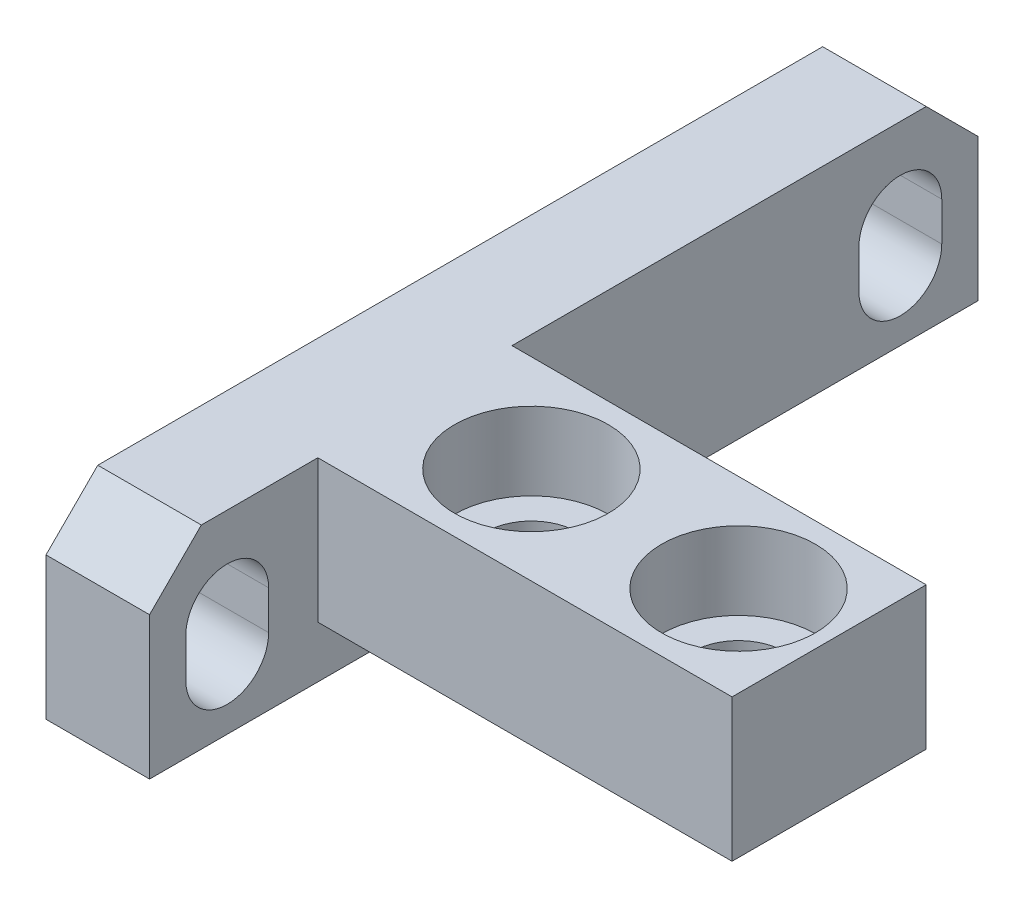
ISO-10303-21;
HEADER;
FILE_DESCRIPTION(('STEP AP214'),'2;1');
FILE_NAME('part.step','',(''),(''),'','','');
FILE_SCHEMA(('AUTOMOTIVE_DESIGN { 1 0 10303 214 1 1 1 1 }'));
ENDSEC;
DATA;
#1=APPLICATION_CONTEXT('core data for automotive mechanical design processes');
#2=APPLICATION_PROTOCOL_DEFINITION('international standard','automotive_design',2000,#1);
#3=PRODUCT_CONTEXT('',#1,'mechanical');
#4=PRODUCT('Part','Part','',(#3));
#5=PRODUCT_RELATED_PRODUCT_CATEGORY('part','',(#4));
#6=PRODUCT_DEFINITION_FORMATION('','',#4);
#7=PRODUCT_DEFINITION_CONTEXT('part definition',#1,'design');
#8=PRODUCT_DEFINITION('design','',#6,#7);
#9=PRODUCT_DEFINITION_SHAPE('','',#8);
#10=(LENGTH_UNIT() NAMED_UNIT(*) SI_UNIT(.MILLI.,.METRE.));
#11=(NAMED_UNIT(*) PLANE_ANGLE_UNIT() SI_UNIT($,.RADIAN.));
#12=(NAMED_UNIT(*) SI_UNIT($,.STERADIAN.) SOLID_ANGLE_UNIT());
#13=UNCERTAINTY_MEASURE_WITH_UNIT(LENGTH_MEASURE(1.E-05),#10,'distance_accuracy_value','');
#14=(GEOMETRIC_REPRESENTATION_CONTEXT(3) GLOBAL_UNCERTAINTY_ASSIGNED_CONTEXT((#13)) GLOBAL_UNIT_ASSIGNED_CONTEXT((#10,
#11,#12)) REPRESENTATION_CONTEXT('',''));
#15=CARTESIAN_POINT('',(0.,0.,0.));
#16=DIRECTION('',(0.,0.,1.));
#17=DIRECTION('',(1.,0.,0.));
#18=AXIS2_PLACEMENT_3D('',#15,#16,#17);
#19=CARTESIAN_POINT('',(-6.2069806856867,11.6480769609291,30.6));
#20=DIRECTION('',(0.,0.,1.));
#21=DIRECTION('',(1.,0.,0.));
#22=AXIS2_PLACEMENT_3D('',#19,#20,#21);
#23=PLANE('',#22);
#24=DIRECTION('',(-1.,0.,0.));
#25=VECTOR('',#24,1.);
#26=CARTESIAN_POINT('',(-6.2069806856867,11.6480769609291,30.6));
#27=LINE('',#26,#25);
#28=CARTESIAN_POINT('',(-10.2069806856867,11.6480769609291,30.6));
#29=VERTEX_POINT('',#28);
#30=CARTESIAN_POINT('',(-6.2069806856867,11.6480769609291,30.6));
#31=VERTEX_POINT('',#30);
#32=EDGE_CURVE('E239',#29,#31,#27,.F.);
#33=ORIENTED_EDGE('',*,*,#32,.T.);
#34=DIRECTION('',(0.,1.,0.));
#35=VECTOR('',#34,1.);
#36=CARTESIAN_POINT('',(-6.2069806856867,11.6480769609291,30.6));
#37=LINE('',#36,#35);
#38=CARTESIAN_POINT('',(-6.2069806856867,10.1480769609291,30.6));
#39=VERTEX_POINT('',#38);
#40=EDGE_CURVE('E263',#39,#31,#37,.T.);
#41=ORIENTED_EDGE('',*,*,#40,.F.);
#42=DIRECTION('',(-1.,0.,0.));
#43=VECTOR('',#42,1.);
#44=CARTESIAN_POINT('',(-6.2069806856867,10.1480769609291,30.6));
#45=LINE('',#44,#43);
#46=CARTESIAN_POINT('',(-10.2069806856867,10.1480769609291,30.6));
#47=VERTEX_POINT('',#46);
#48=EDGE_CURVE('E242',#39,#47,#45,.T.);
#49=ORIENTED_EDGE('',*,*,#48,.T.);
#50=DIRECTION('',(0.,1.,0.));
#51=VECTOR('',#50,1.);
#52=CARTESIAN_POINT('',(-10.2069806856867,11.6480769609291,30.6));
#53=LINE('',#52,#51);
#54=EDGE_CURVE('E111',#29,#47,#53,.F.);
#55=ORIENTED_EDGE('',*,*,#54,.F.);
#56=EDGE_LOOP('',(#33,#41,#49,#55));
#57=FACE_BOUND('',#56,.T.);
#58=ADVANCED_FACE('F17',(#57),#23,.F.);
#59=CARTESIAN_POINT('',(-6.2069806856867,10.1480769609291,27.4));
#60=DIRECTION('',(0.,0.,-1.));
#61=DIRECTION('',(-1.,0.,0.));
#62=AXIS2_PLACEMENT_3D('',#59,#60,#61);
#63=PLANE('',#62);
#64=DIRECTION('',(-1.,0.,0.));
#65=VECTOR('',#64,1.);
#66=CARTESIAN_POINT('',(-6.2069806856867,10.1480769609291,27.4));
#67=LINE('',#66,#65);
#68=CARTESIAN_POINT('',(-10.2069806856867,10.1480769609291,27.4));
#69=VERTEX_POINT('',#68);
#70=CARTESIAN_POINT('',(-6.2069806856867,10.1480769609291,27.4));
#71=VERTEX_POINT('',#70);
#72=EDGE_CURVE('E245',#69,#71,#67,.F.);
#73=ORIENTED_EDGE('',*,*,#72,.T.);
#74=DIRECTION('',(0.,1.,0.));
#75=VECTOR('',#74,1.);
#76=CARTESIAN_POINT('',(-6.2069806856867,10.1480769609291,27.4));
#77=LINE('',#76,#75);
#78=CARTESIAN_POINT('',(-6.2069806856867,11.6480769609291,27.4));
#79=VERTEX_POINT('',#78);
#80=EDGE_CURVE('E259',#79,#71,#77,.F.);
#81=ORIENTED_EDGE('',*,*,#80,.F.);
#82=DIRECTION('',(-1.,0.,0.));
#83=VECTOR('',#82,1.);
#84=CARTESIAN_POINT('',(-6.2069806856867,11.6480769609291,27.4));
#85=LINE('',#84,#83);
#86=CARTESIAN_POINT('',(-10.2069806856867,11.6480769609291,27.4));
#87=VERTEX_POINT('',#86);
#88=EDGE_CURVE('E236',#79,#87,#85,.T.);
#89=ORIENTED_EDGE('',*,*,#88,.T.);
#90=DIRECTION('',(0.,1.,0.));
#91=VECTOR('',#90,1.);
#92=CARTESIAN_POINT('',(-10.2069806856867,10.1480769609291,27.4));
#93=LINE('',#92,#91);
#94=EDGE_CURVE('E258',#69,#87,#93,.T.);
#95=ORIENTED_EDGE('',*,*,#94,.F.);
#96=EDGE_LOOP('',(#73,#81,#89,#95));
#97=FACE_BOUND('',#96,.T.);
#98=ADVANCED_FACE('F401',(#97),#63,.F.);
#99=CARTESIAN_POINT('',(-6.2069806856867,11.6480769609291,4.60000000000002));
#100=DIRECTION('',(0.,0.,1.));
#101=DIRECTION('',(1.,0.,0.));
#102=AXIS2_PLACEMENT_3D('',#99,#100,#101);
#103=PLANE('',#102);
#104=DIRECTION('',(-1.,0.,0.));
#105=VECTOR('',#104,1.);
#106=CARTESIAN_POINT('',(-6.2069806856867,11.6480769609291,4.60000000000002));
#107=LINE('',#106,#105);
#108=CARTESIAN_POINT('',(-10.2069806856867,11.6480769609291,4.60000000000002));
#109=VERTEX_POINT('',#108);
#110=CARTESIAN_POINT('',(-6.2069806856867,11.6480769609291,4.60000000000002));
#111=VERTEX_POINT('',#110);
#112=EDGE_CURVE('E225',#109,#111,#107,.F.);
#113=ORIENTED_EDGE('',*,*,#112,.T.);
#114=DIRECTION('',(0.,1.,0.));
#115=VECTOR('',#114,1.);
#116=CARTESIAN_POINT('',(-6.2069806856867,11.6480769609291,4.60000000000002));
#117=LINE('',#116,#115);
#118=CARTESIAN_POINT('',(-6.2069806856867,10.1480769609291,4.60000000000002));
#119=VERTEX_POINT('',#118);
#120=EDGE_CURVE('E256',#119,#111,#117,.T.);
#121=ORIENTED_EDGE('',*,*,#120,.F.);
#122=DIRECTION('',(-1.,0.,0.));
#123=VECTOR('',#122,1.);
#124=CARTESIAN_POINT('',(-6.2069806856867,10.1480769609291,4.60000000000002));
#125=LINE('',#124,#123);
#126=CARTESIAN_POINT('',(-10.2069806856867,10.1480769609291,4.60000000000002));
#127=VERTEX_POINT('',#126);
#128=EDGE_CURVE('E229',#119,#127,#125,.T.);
#129=ORIENTED_EDGE('',*,*,#128,.T.);
#130=DIRECTION('',(0.,1.,0.));
#131=VECTOR('',#130,1.);
#132=CARTESIAN_POINT('',(-10.2069806856867,11.6480769609291,4.60000000000002));
#133=LINE('',#132,#131);
#134=EDGE_CURVE('E253',#109,#127,#133,.F.);
#135=ORIENTED_EDGE('',*,*,#134,.F.);
#136=EDGE_LOOP('',(#113,#121,#129,#135));
#137=FACE_BOUND('',#136,.T.);
#138=ADVANCED_FACE('F414',(#137),#103,.F.);
#139=CARTESIAN_POINT('',(-6.2069806856867,10.1480769609291,1.40000000000001));
#140=DIRECTION('',(0.,0.,-1.));
#141=DIRECTION('',(-1.,0.,0.));
#142=AXIS2_PLACEMENT_3D('',#139,#140,#141);
#143=PLANE('',#142);
#144=DIRECTION('',(-1.,0.,0.));
#145=VECTOR('',#144,1.);
#146=CARTESIAN_POINT('',(-6.2069806856867,10.1480769609291,1.40000000000001));
#147=LINE('',#146,#145);
#148=CARTESIAN_POINT('',(-10.2069806856867,10.1480769609291,1.40000000000001));
#149=VERTEX_POINT('',#148);
#150=CARTESIAN_POINT('',(-6.2069806856867,10.1480769609291,1.40000000000001));
#151=VERTEX_POINT('',#150);
#152=EDGE_CURVE('E233',#149,#151,#147,.F.);
#153=ORIENTED_EDGE('',*,*,#152,.T.);
#154=DIRECTION('',(0.,1.,0.));
#155=VECTOR('',#154,1.);
#156=CARTESIAN_POINT('',(-6.2069806856867,10.1480769609291,1.40000000000001));
#157=LINE('',#156,#155);
#158=CARTESIAN_POINT('',(-6.2069806856867,11.6480769609291,1.40000000000001));
#159=VERTEX_POINT('',#158);
#160=EDGE_CURVE('E250',#159,#151,#157,.F.);
#161=ORIENTED_EDGE('',*,*,#160,.F.);
#162=DIRECTION('',(-1.,0.,0.));
#163=VECTOR('',#162,1.);
#164=CARTESIAN_POINT('',(-6.2069806856867,11.6480769609291,1.40000000000001));
#165=LINE('',#164,#163);
#166=CARTESIAN_POINT('',(-10.2069806856867,11.6480769609291,1.40000000000001));
#167=VERTEX_POINT('',#166);
#168=EDGE_CURVE('E228',#159,#167,#165,.T.);
#169=ORIENTED_EDGE('',*,*,#168,.T.);
#170=DIRECTION('',(0.,1.,0.));
#171=VECTOR('',#170,1.);
#172=CARTESIAN_POINT('',(-10.2069806856867,10.1480769609291,1.40000000000001));
#173=LINE('',#172,#171);
#174=EDGE_CURVE('E252',#149,#167,#173,.T.);
#175=ORIENTED_EDGE('',*,*,#174,.F.);
#176=EDGE_LOOP('',(#153,#161,#169,#175));
#177=FACE_BOUND('',#176,.T.);
#178=ADVANCED_FACE('F373',(#177),#143,.F.);
#179=CARTESIAN_POINT('',(-1.70698068568669,12.0480769609291,21.75));
#180=DIRECTION('',(0.,-1.,0.));
#181=DIRECTION('',(0.,0.,-1.));
#182=AXIS2_PLACEMENT_3D('',#179,#180,#181);
#183=CYLINDRICAL_SURFACE('',#182,1.78);
#184=CARTESIAN_POINT('',(-1.70698068568669,9.54807696092915,21.75));
#185=DIRECTION('',(0.,-1.,0.));
#186=DIRECTION('',(0.,0.,-1.));
#187=AXIS2_PLACEMENT_3D('',#184,#185,#186);
#188=CIRCLE('',#187,1.78);
#189=CARTESIAN_POINT('',(-1.70698068568669,9.54807696092915,19.97));
#190=VERTEX_POINT('',#189);
#191=EDGE_CURVE('E248',#190,#190,#188,.T.);
#192=ORIENTED_EDGE('',*,*,#191,.T.);
#193=EDGE_LOOP('',(#192));
#194=FACE_BOUND('',#193,.T.);
#195=CARTESIAN_POINT('',(-1.70698068568669,12.0480769609291,21.75));
#196=DIRECTION('',(0.,-1.,0.));
#197=DIRECTION('',(0.,0.,-1.));
#198=AXIS2_PLACEMENT_3D('',#195,#196,#197);
#199=CIRCLE('',#198,1.78);
#200=CARTESIAN_POINT('',(-1.70698068568669,12.0480769609291,19.97));
#201=VERTEX_POINT('',#200);
#202=EDGE_CURVE('E232',#201,#201,#199,.F.);
#203=ORIENTED_EDGE('',*,*,#202,.T.);
#204=EDGE_LOOP('',(#203));
#205=FACE_BOUND('',#204,.T.);
#206=ADVANCED_FACE('F369',(#194,#205),#183,.F.);
#207=CARTESIAN_POINT('',(6.29301931431331,12.0480769609291,21.75));
#208=DIRECTION('',(0.,-1.,0.));
#209=DIRECTION('',(0.,0.,-1.));
#210=AXIS2_PLACEMENT_3D('',#207,#208,#209);
#211=CYLINDRICAL_SURFACE('',#210,1.77999999999999);
#212=CARTESIAN_POINT('',(6.29301931431331,9.54807696092915,21.75));
#213=DIRECTION('',(0.,-1.,0.));
#214=DIRECTION('',(0.,0.,-1.));
#215=AXIS2_PLACEMENT_3D('',#212,#213,#214);
#216=CIRCLE('',#215,1.77999999999999);
#217=CARTESIAN_POINT('',(6.29301931431331,9.54807696092915,19.97));
#218=VERTEX_POINT('',#217);
#219=EDGE_CURVE('E21',#218,#218,#216,.T.);
#220=ORIENTED_EDGE('',*,*,#219,.T.);
#221=EDGE_LOOP('',(#220));
#222=FACE_BOUND('',#221,.T.);
#223=CARTESIAN_POINT('',(6.29301931431331,12.0480769609291,21.75));
#224=DIRECTION('',(0.,-1.,0.));
#225=DIRECTION('',(0.,0.,-1.));
#226=AXIS2_PLACEMENT_3D('',#223,#224,#225);
#227=CIRCLE('',#226,1.77999999999999);
#228=CARTESIAN_POINT('',(6.29301931431331,12.0480769609291,19.97));
#229=VERTEX_POINT('',#228);
#230=EDGE_CURVE('E292',#229,#229,#227,.F.);
#231=ORIENTED_EDGE('',*,*,#230,.T.);
#232=EDGE_LOOP('',(#231));
#233=FACE_BOUND('',#232,.T.);
#234=ADVANCED_FACE('F372',(#222,#233),#211,.F.);
#235=CARTESIAN_POINT('',(-1.07970795841395,12.1708042336564,32.));
#236=DIRECTION('',(0.,0.,1.));
#237=DIRECTION('',(1.,0.,0.));
#238=AXIS2_PLACEMENT_3D('',#235,#236,#237);
#239=PLANE('',#238);
#240=DIRECTION('',(1.,0.,0.));
#241=VECTOR('',#240,1.);
#242=CARTESIAN_POINT('',(-6.2069806856867,7.54807696092912,32.));
#243=LINE('',#242,#241);
#244=CARTESIAN_POINT('',(-6.2069806856867,7.54807696092912,32.));
#245=VERTEX_POINT('',#244);
#246=CARTESIAN_POINT('',(-10.2069806856867,7.54807696092912,32.));
#247=VERTEX_POINT('',#246);
#248=EDGE_CURVE('E121',#245,#247,#243,.F.);
#249=ORIENTED_EDGE('',*,*,#248,.F.);
#250=DIRECTION('',(0.,1.,0.));
#251=VECTOR('',#250,1.);
#252=CARTESIAN_POINT('',(-6.2069806856867,10.5480769609291,32.));
#253=LINE('',#252,#251);
#254=CARTESIAN_POINT('',(-6.2069806856867,13.0480769609291,32.));
#255=VERTEX_POINT('',#254);
#256=EDGE_CURVE('E198',#255,#245,#253,.F.);
#257=ORIENTED_EDGE('',*,*,#256,.F.);
#258=DIRECTION('',(1.,0.,0.));
#259=VECTOR('',#258,1.);
#260=CARTESIAN_POINT('',(-5.64334432205033,13.0480769609291,32.));
#261=LINE('',#260,#259);
#262=CARTESIAN_POINT('',(-10.2069806856867,13.0480769609291,32.));
#263=VERTEX_POINT('',#262);
#264=EDGE_CURVE('E150',#263,#255,#261,.T.);
#265=ORIENTED_EDGE('',*,*,#264,.F.);
#266=DIRECTION('',(0.,1.,0.));
#267=VECTOR('',#266,1.);
#268=CARTESIAN_POINT('',(-10.2069806856867,7.54807696092912,32.));
#269=LINE('',#268,#267);
#270=EDGE_CURVE('E291',#247,#263,#269,.T.);
#271=ORIENTED_EDGE('',*,*,#270,.F.);
#272=EDGE_LOOP('',(#249,#257,#265,#271));
#273=FACE_BOUND('',#272,.T.);
#274=ADVANCED_FACE('F335',(#273),#239,.T.);
#275=CARTESIAN_POINT('',(-6.2069806856867,7.54807696092912,0.));
#276=DIRECTION('',(0.,-1.,0.));
#277=DIRECTION('',(0.,0.,-1.));
#278=AXIS2_PLACEMENT_3D('',#275,#276,#277);
#279=PLANE('',#278);
#280=DIRECTION('',(1.,0.,0.));
#281=VECTOR('',#280,1.);
#282=CARTESIAN_POINT('',(-1.07970795841395,7.54807696092912,0.));
#283=LINE('',#282,#281);
#284=CARTESIAN_POINT('',(-10.2069806856867,7.54807696092912,0.));
#285=VERTEX_POINT('',#284);
#286=CARTESIAN_POINT('',(-6.2069806856867,7.54807696092912,0.));
#287=VERTEX_POINT('',#286);
#288=EDGE_CURVE('E301',#285,#287,#283,.T.);
#289=ORIENTED_EDGE('',*,*,#288,.T.);
#290=DIRECTION('',(0.,0.,-1.));
#291=VECTOR('',#290,1.);
#292=CARTESIAN_POINT('',(-6.2069806856867,7.54807696092912,0.));
#293=LINE('',#292,#291);
#294=EDGE_CURVE('E195',#245,#287,#293,.T.);
#295=ORIENTED_EDGE('',*,*,#294,.F.);
#296=ORIENTED_EDGE('',*,*,#248,.T.);
#297=DIRECTION('',(0.,0.,1.));
#298=VECTOR('',#297,1.);
#299=CARTESIAN_POINT('',(-10.2069806856867,7.54807696092912,0.));
#300=LINE('',#299,#298);
#301=EDGE_CURVE('E311',#285,#247,#300,.T.);
#302=ORIENTED_EDGE('',*,*,#301,.F.);
#303=EDGE_LOOP('',(#289,#295,#296,#302));
#304=FACE_BOUND('',#303,.T.);
#305=ADVANCED_FACE('F336',(#304),#279,.T.);
#306=CARTESIAN_POINT('',(-1.07970795841395,12.1708042336564,0.));
#307=DIRECTION('',(0.,0.,1.));
#308=DIRECTION('',(1.,0.,0.));
#309=AXIS2_PLACEMENT_3D('',#306,#307,#308);
#310=PLANE('',#309);
#311=DIRECTION('',(0.,1.,0.));
#312=VECTOR('',#311,1.);
#313=CARTESIAN_POINT('',(-6.2069806856867,10.5480769609291,0.));
#314=LINE('',#313,#312);
#315=CARTESIAN_POINT('',(-6.2069806856867,13.0480769609291,0.));
#316=VERTEX_POINT('',#315);
#317=EDGE_CURVE('E192',#287,#316,#314,.T.);
#318=ORIENTED_EDGE('',*,*,#317,.F.);
#319=ORIENTED_EDGE('',*,*,#288,.F.);
#320=DIRECTION('',(0.,1.,0.));
#321=VECTOR('',#320,1.);
#322=CARTESIAN_POINT('',(-10.2069806856867,7.54807696092912,0.));
#323=LINE('',#322,#321);
#324=CARTESIAN_POINT('',(-10.2069806856867,13.0480769609291,0.));
#325=VERTEX_POINT('',#324);
#326=EDGE_CURVE('E314',#325,#285,#323,.F.);
#327=ORIENTED_EDGE('',*,*,#326,.F.);
#328=DIRECTION('',(1.,0.,0.));
#329=VECTOR('',#328,1.);
#330=CARTESIAN_POINT('',(-5.64334432205033,13.0480769609291,0.));
#331=LINE('',#330,#329);
#332=EDGE_CURVE('E295',#316,#325,#331,.F.);
#333=ORIENTED_EDGE('',*,*,#332,.F.);
#334=EDGE_LOOP('',(#318,#319,#327,#333));
#335=FACE_BOUND('',#334,.T.);
#336=ADVANCED_FACE('F339',(#335),#310,.F.);
#337=CARTESIAN_POINT('',(1.79301931431333,9.54807696092915,21.75));
#338=DIRECTION('',(0.,1.,0.));
#339=DIRECTION('',(0.,0.,1.));
#340=AXIS2_PLACEMENT_3D('',#337,#338,#339);
#341=PLANE('',#340);
#342=ORIENTED_EDGE('',*,*,#191,.F.);
#343=EDGE_LOOP('',(#342));
#344=FACE_BOUND('',#343,.T.);
#345=ORIENTED_EDGE('',*,*,#219,.F.);
#346=EDGE_LOOP('',(#345));
#347=FACE_BOUND('',#346,.T.);
#348=DIRECTION('',(-1.,0.,0.));
#349=VECTOR('',#348,1.);
#350=CARTESIAN_POINT('',(9.79301931431331,9.54807696092915,25.5));
#351=LINE('',#350,#349);
#352=CARTESIAN_POINT('',(9.79301931431331,9.54807696092915,25.5));
#353=VERTEX_POINT('',#352);
#354=CARTESIAN_POINT('',(-6.20698068568668,9.54807696092914,25.5));
#355=VERTEX_POINT('',#354);
#356=EDGE_CURVE('E156',#353,#355,#351,.T.);
#357=ORIENTED_EDGE('',*,*,#356,.T.);
#358=DIRECTION('',(0.,0.,-1.));
#359=VECTOR('',#358,1.);
#360=CARTESIAN_POINT('',(-6.2069806856867,9.54807696092912,0.));
#361=LINE('',#360,#359);
#362=CARTESIAN_POINT('',(-6.20698068568668,9.54807696092913,18.));
#363=VERTEX_POINT('',#362);
#364=EDGE_CURVE('E160',#363,#355,#361,.F.);
#365=ORIENTED_EDGE('',*,*,#364,.F.);
#366=DIRECTION('',(1.,0.,0.));
#367=VECTOR('',#366,1.);
#368=CARTESIAN_POINT('',(-6.20698068568667,9.54807696092912,18.));
#369=LINE('',#368,#367);
#370=CARTESIAN_POINT('',(9.79301931431331,9.54807696092914,18.));
#371=VERTEX_POINT('',#370);
#372=EDGE_CURVE('E187',#363,#371,#369,.T.);
#373=ORIENTED_EDGE('',*,*,#372,.T.);
#374=DIRECTION('',(0.,0.,-1.));
#375=VECTOR('',#374,1.);
#376=CARTESIAN_POINT('',(9.79301931431331,9.54807696092915,0.));
#377=LINE('',#376,#375);
#378=EDGE_CURVE('E162',#353,#371,#377,.T.);
#379=ORIENTED_EDGE('',*,*,#378,.F.);
#380=EDGE_LOOP('',(#357,#365,#373,#379));
#381=FACE_BOUND('',#380,.T.);
#382=ADVANCED_FACE('F158',(#344,#347,#381),#341,.F.);
#383=CARTESIAN_POINT('',(-6.2069806856867,10.1480769609291,29.));
#384=DIRECTION('',(-1.,0.,0.));
#385=DIRECTION('',(0.,0.,1.));
#386=AXIS2_PLACEMENT_3D('',#383,#384,#385);
#387=CYLINDRICAL_SURFACE('',#386,1.6);
#388=ORIENTED_EDGE('',*,*,#48,.F.);
#389=CARTESIAN_POINT('',(-6.2069806856867,10.1480769609291,29.));
#390=DIRECTION('',(-1.,0.,0.));
#391=DIRECTION('',(0.,0.,1.));
#392=AXIS2_PLACEMENT_3D('',#389,#390,#391);
#393=CIRCLE('',#392,1.6);
#394=EDGE_CURVE('E179',#71,#39,#393,.T.);
#395=ORIENTED_EDGE('',*,*,#394,.F.);
#396=ORIENTED_EDGE('',*,*,#72,.F.);
#397=CARTESIAN_POINT('',(-10.2069806856867,10.1480769609291,29.));
#398=DIRECTION('',(-1.,0.,0.));
#399=DIRECTION('',(0.,0.,1.));
#400=AXIS2_PLACEMENT_3D('',#397,#398,#399);
#401=CIRCLE('',#400,1.6);
#402=EDGE_CURVE('E289',#47,#69,#401,.F.);
#403=ORIENTED_EDGE('',*,*,#402,.F.);
#404=EDGE_LOOP('',(#388,#395,#396,#403));
#405=FACE_BOUND('',#404,.T.);
#406=ADVANCED_FACE('F407',(#405),#387,.F.);
#407=CARTESIAN_POINT('',(-6.2069806856867,11.6480769609291,29.));
#408=DIRECTION('',(-1.,0.,0.));
#409=DIRECTION('',(0.,0.,1.));
#410=AXIS2_PLACEMENT_3D('',#407,#408,#409);
#411=CYLINDRICAL_SURFACE('',#410,1.6);
#412=ORIENTED_EDGE('',*,*,#88,.F.);
#413=CARTESIAN_POINT('',(-6.2069806856867,11.6480769609291,29.));
#414=DIRECTION('',(-1.,0.,0.));
#415=DIRECTION('',(0.,0.,1.));
#416=AXIS2_PLACEMENT_3D('',#413,#414,#415);
#417=CIRCLE('',#416,1.6);
#418=EDGE_CURVE('E182',#31,#79,#417,.T.);
#419=ORIENTED_EDGE('',*,*,#418,.F.);
#420=ORIENTED_EDGE('',*,*,#32,.F.);
#421=CARTESIAN_POINT('',(-10.2069806856867,11.6480769609291,29.));
#422=DIRECTION('',(-1.,0.,0.));
#423=DIRECTION('',(0.,0.,1.));
#424=AXIS2_PLACEMENT_3D('',#421,#422,#423);
#425=CIRCLE('',#424,1.6);
#426=EDGE_CURVE('E287',#87,#29,#425,.F.);
#427=ORIENTED_EDGE('',*,*,#426,.F.);
#428=EDGE_LOOP('',(#412,#419,#420,#427));
#429=FACE_BOUND('',#428,.T.);
#430=ADVANCED_FACE('F398',(#429),#411,.F.);
#431=CARTESIAN_POINT('',(-6.2069806856867,10.1480769609291,3.00000000000001));
#432=DIRECTION('',(-1.,0.,0.));
#433=DIRECTION('',(0.,0.,1.));
#434=AXIS2_PLACEMENT_3D('',#431,#432,#433);
#435=CYLINDRICAL_SURFACE('',#434,1.6);
#436=ORIENTED_EDGE('',*,*,#128,.F.);
#437=CARTESIAN_POINT('',(-6.2069806856867,10.1480769609291,3.00000000000001));
#438=DIRECTION('',(-1.,0.,0.));
#439=DIRECTION('',(0.,0.,1.));
#440=AXIS2_PLACEMENT_3D('',#437,#438,#439);
#441=CIRCLE('',#440,1.6);
#442=EDGE_CURVE('E275',#151,#119,#441,.T.);
#443=ORIENTED_EDGE('',*,*,#442,.F.);
#444=ORIENTED_EDGE('',*,*,#152,.F.);
#445=CARTESIAN_POINT('',(-10.2069806856867,10.1480769609291,3.00000000000001));
#446=DIRECTION('',(-1.,0.,0.));
#447=DIRECTION('',(0.,0.,1.));
#448=AXIS2_PLACEMENT_3D('',#445,#446,#447);
#449=CIRCLE('',#448,1.6);
#450=EDGE_CURVE('E284',#127,#149,#449,.F.);
#451=ORIENTED_EDGE('',*,*,#450,.F.);
#452=EDGE_LOOP('',(#436,#443,#444,#451));
#453=FACE_BOUND('',#452,.T.);
#454=ADVANCED_FACE('F436',(#453),#435,.F.);
#455=CARTESIAN_POINT('',(-6.2069806856867,11.6480769609291,3.00000000000001));
#456=DIRECTION('',(-1.,0.,0.));
#457=DIRECTION('',(0.,0.,1.));
#458=AXIS2_PLACEMENT_3D('',#455,#456,#457);
#459=CYLINDRICAL_SURFACE('',#458,1.6);
#460=ORIENTED_EDGE('',*,*,#168,.F.);
#461=CARTESIAN_POINT('',(-6.2069806856867,11.6480769609291,3.00000000000001));
#462=DIRECTION('',(-1.,0.,0.));
#463=DIRECTION('',(0.,0.,1.));
#464=AXIS2_PLACEMENT_3D('',#461,#462,#463);
#465=CIRCLE('',#464,1.6);
#466=EDGE_CURVE('E272',#111,#159,#465,.T.);
#467=ORIENTED_EDGE('',*,*,#466,.F.);
#468=ORIENTED_EDGE('',*,*,#112,.F.);
#469=CARTESIAN_POINT('',(-10.2069806856867,11.6480769609291,3.00000000000001));
#470=DIRECTION('',(-1.,0.,0.));
#471=DIRECTION('',(0.,0.,1.));
#472=AXIS2_PLACEMENT_3D('',#469,#470,#471);
#473=CIRCLE('',#472,1.6);
#474=EDGE_CURVE('E280',#167,#109,#473,.F.);
#475=ORIENTED_EDGE('',*,*,#474,.F.);
#476=EDGE_LOOP('',(#460,#467,#468,#475));
#477=FACE_BOUND('',#476,.T.);
#478=ADVANCED_FACE('F377',(#477),#459,.F.);
#479=CARTESIAN_POINT('',(-4.6769806856867,12.0480769609291,18.7206));
#480=DIRECTION('',(0.,-1.,0.));
#481=DIRECTION('',(1.,0.,0.));
#482=AXIS2_PLACEMENT_3D('',#479,#480,#481);
#483=PLANE('',#482);
#484=ORIENTED_EDGE('',*,*,#202,.F.);
#485=EDGE_LOOP('',(#484));
#486=FACE_BOUND('',#485,.T.);
#487=CARTESIAN_POINT('',(-1.70698068568669,12.0480769609291,21.75));
#488=DIRECTION('',(0.,-1.,0.));
#489=DIRECTION('',(0.,0.,-1.));
#490=AXIS2_PLACEMENT_3D('',#487,#488,#489);
#491=CIRCLE('',#490,2.97000000000001);
#492=CARTESIAN_POINT('',(-1.70698068568669,12.0480769609291,18.78));
#493=VERTEX_POINT('',#492);
#494=EDGE_CURVE('E269',#493,#493,#491,.F.);
#495=ORIENTED_EDGE('',*,*,#494,.T.);
#496=EDGE_LOOP('',(#495));
#497=FACE_BOUND('',#496,.T.);
#498=ADVANCED_FACE('F353',(#486,#497),#483,.F.);
#499=CARTESIAN_POINT('',(3.32301931431331,12.0480769609291,18.7206));
#500=DIRECTION('',(0.,-1.,0.));
#501=DIRECTION('',(1.,0.,0.));
#502=AXIS2_PLACEMENT_3D('',#499,#500,#501);
#503=PLANE('',#502);
#504=ORIENTED_EDGE('',*,*,#230,.F.);
#505=EDGE_LOOP('',(#504));
#506=FACE_BOUND('',#505,.T.);
#507=CARTESIAN_POINT('',(6.29301931431331,12.0480769609291,21.75));
#508=DIRECTION('',(0.,-1.,0.));
#509=DIRECTION('',(0.,0.,-1.));
#510=AXIS2_PLACEMENT_3D('',#507,#508,#509);
#511=CIRCLE('',#510,2.97);
#512=CARTESIAN_POINT('',(6.29301931431331,12.0480769609291,18.78));
#513=VERTEX_POINT('',#512);
#514=EDGE_CURVE('E224',#513,#513,#511,.F.);
#515=ORIENTED_EDGE('',*,*,#514,.T.);
#516=EDGE_LOOP('',(#515));
#517=FACE_BOUND('',#516,.T.);
#518=ADVANCED_FACE('F344',(#506,#517),#503,.F.);
#519=CARTESIAN_POINT('',(-5.64334432205033,14.0480769609291,0.999999999999988));
#520=DIRECTION('',(0.,0.707106781186548,-0.707106781186547));
#521=DIRECTION('',(0.,0.707106781186547,0.707106781186548));
#522=AXIS2_PLACEMENT_3D('',#519,#520,#521);
#523=PLANE('',#522);
#524=DIRECTION('',(0.,-0.707106781186543,-0.707106781186552));
#525=VECTOR('',#524,1.);
#526=CARTESIAN_POINT('',(-10.2069806856867,15.0480769609291,2.));
#527=LINE('',#526,#525);
#528=CARTESIAN_POINT('',(-10.2069806856867,15.0480769609291,1.99999999999999));
#529=VERTEX_POINT('',#528);
#530=EDGE_CURVE('E309',#529,#325,#527,.T.);
#531=ORIENTED_EDGE('',*,*,#530,.F.);
#532=DIRECTION('',(1.,0.,0.));
#533=VECTOR('',#532,1.);
#534=CARTESIAN_POINT('',(-10.2069806856867,15.0480769609291,2.));
#535=LINE('',#534,#533);
#536=CARTESIAN_POINT('',(-6.20698068568669,15.0480769609291,1.99999999999999));
#537=VERTEX_POINT('',#536);
#538=EDGE_CURVE('E221',#537,#529,#535,.F.);
#539=ORIENTED_EDGE('',*,*,#538,.F.);
#540=DIRECTION('',(0.,0.707106781186543,0.707106781186552));
#541=VECTOR('',#540,1.);
#542=CARTESIAN_POINT('',(-6.2069806856867,13.0480769609291,0.));
#543=LINE('',#542,#541);
#544=EDGE_CURVE('E184',#316,#537,#543,.T.);
#545=ORIENTED_EDGE('',*,*,#544,.F.);
#546=ORIENTED_EDGE('',*,*,#332,.T.);
#547=EDGE_LOOP('',(#531,#539,#545,#546));
#548=FACE_BOUND('',#547,.T.);
#549=ADVANCED_FACE('F342',(#548),#523,.T.);
#550=CARTESIAN_POINT('',(-10.2069806856867,7.54807696092912,0.));
#551=DIRECTION('',(-1.,0.,0.));
#552=DIRECTION('',(0.,0.,1.));
#553=AXIS2_PLACEMENT_3D('',#550,#551,#552);
#554=PLANE('',#553);
#555=ORIENTED_EDGE('',*,*,#474,.T.);
#556=ORIENTED_EDGE('',*,*,#134,.T.);
#557=ORIENTED_EDGE('',*,*,#450,.T.);
#558=ORIENTED_EDGE('',*,*,#174,.T.);
#559=EDGE_LOOP('',(#555,#556,#557,#558));
#560=FACE_BOUND('',#559,.T.);
#561=ORIENTED_EDGE('',*,*,#426,.T.);
#562=ORIENTED_EDGE('',*,*,#54,.T.);
#563=ORIENTED_EDGE('',*,*,#402,.T.);
#564=ORIENTED_EDGE('',*,*,#94,.T.);
#565=EDGE_LOOP('',(#561,#562,#563,#564));
#566=FACE_BOUND('',#565,.T.);
#567=DIRECTION('',(0.,-0.707106781186547,0.707106781186548));
#568=VECTOR('',#567,1.);
#569=CARTESIAN_POINT('',(-10.2069806856867,14.0480769609291,31.));
#570=LINE('',#569,#568);
#571=CARTESIAN_POINT('',(-10.2069806856867,15.0480769609291,30.));
#572=VERTEX_POINT('',#571);
#573=EDGE_CURVE('E283',#572,#263,#570,.T.);
#574=ORIENTED_EDGE('',*,*,#573,.F.);
#575=DIRECTION('',(0.,0.,1.));
#576=VECTOR('',#575,1.);
#577=CARTESIAN_POINT('',(-10.2069806856867,15.0480769609291,0.));
#578=LINE('',#577,#576);
#579=EDGE_CURVE('E218',#529,#572,#578,.T.);
#580=ORIENTED_EDGE('',*,*,#579,.F.);
#581=ORIENTED_EDGE('',*,*,#530,.T.);
#582=ORIENTED_EDGE('',*,*,#326,.T.);
#583=ORIENTED_EDGE('',*,*,#301,.T.);
#584=ORIENTED_EDGE('',*,*,#270,.T.);
#585=EDGE_LOOP('',(#574,#580,#581,#582,#583,#584));
#586=FACE_BOUND('',#585,.T.);
#587=ADVANCED_FACE('F333',(#560,#566,#586),#554,.T.);
#588=CARTESIAN_POINT('',(-5.64334432205033,14.0480769609291,31.));
#589=DIRECTION('',(0.,0.707106781186548,0.707106781186547));
#590=DIRECTION('',(0.,-0.707106781186547,0.707106781186548));
#591=AXIS2_PLACEMENT_3D('',#588,#589,#590);
#592=PLANE('',#591);
#593=ORIENTED_EDGE('',*,*,#573,.T.);
#594=ORIENTED_EDGE('',*,*,#264,.T.);
#595=DIRECTION('',(0.,-0.707106781186543,0.707106781186552));
#596=VECTOR('',#595,1.);
#597=CARTESIAN_POINT('',(-6.2069806856867,15.0480769609291,30.));
#598=LINE('',#597,#596);
#599=CARTESIAN_POINT('',(-6.20698068568669,15.0480769609291,30.));
#600=VERTEX_POINT('',#599);
#601=EDGE_CURVE('E175',#600,#255,#598,.T.);
#602=ORIENTED_EDGE('',*,*,#601,.F.);
#603=DIRECTION('',(1.,0.,0.));
#604=VECTOR('',#603,1.);
#605=CARTESIAN_POINT('',(-10.2069806856867,15.0480769609291,30.));
#606=LINE('',#605,#604);
#607=EDGE_CURVE('E215',#572,#600,#606,.T.);
#608=ORIENTED_EDGE('',*,*,#607,.F.);
#609=EDGE_LOOP('',(#593,#594,#602,#608));
#610=FACE_BOUND('',#609,.T.);
#611=ADVANCED_FACE('F330',(#610),#592,.T.);
#612=CARTESIAN_POINT('',(9.79301931431331,15.0480769609291,25.5));
#613=DIRECTION('',(0.,0.,-1.));
#614=DIRECTION('',(-1.,0.,0.));
#615=AXIS2_PLACEMENT_3D('',#612,#613,#614);
#616=PLANE('',#615);
#617=DIRECTION('',(1.,0.,0.));
#618=VECTOR('',#617,1.);
#619=CARTESIAN_POINT('',(-10.2069806856867,15.0480769609291,25.5));
#620=LINE('',#619,#618);
#621=CARTESIAN_POINT('',(-6.20698068568669,15.0480769609291,25.5));
#622=VERTEX_POINT('',#621);
#623=CARTESIAN_POINT('',(9.79301931431331,15.0480769609291,25.5));
#624=VERTEX_POINT('',#623);
#625=EDGE_CURVE('E171',#622,#624,#620,.T.);
#626=ORIENTED_EDGE('',*,*,#625,.F.);
#627=DIRECTION('',(0.,1.,0.));
#628=VECTOR('',#627,1.);
#629=CARTESIAN_POINT('',(-6.2069806856867,10.5480769609291,25.5));
#630=LINE('',#629,#628);
#631=EDGE_CURVE('E168',#355,#622,#630,.T.);
#632=ORIENTED_EDGE('',*,*,#631,.F.);
#633=ORIENTED_EDGE('',*,*,#356,.F.);
#634=DIRECTION('',(0.,1.,0.));
#635=VECTOR('',#634,1.);
#636=CARTESIAN_POINT('',(9.79301931431331,15.0480769609291,25.5));
#637=LINE('',#636,#635);
#638=EDGE_CURVE('E165',#624,#353,#637,.F.);
#639=ORIENTED_EDGE('',*,*,#638,.F.);
#640=EDGE_LOOP('',(#626,#632,#633,#639));
#641=FACE_BOUND('',#640,.T.);
#642=ADVANCED_FACE('F169',(#641),#616,.F.);
#643=CARTESIAN_POINT('',(9.79301931431331,15.0480769609291,0.));
#644=DIRECTION('',(1.,0.,0.));
#645=DIRECTION('',(0.,0.,-1.));
#646=AXIS2_PLACEMENT_3D('',#643,#644,#645);
#647=PLANE('',#646);
#648=DIRECTION('',(0.,1.,0.));
#649=VECTOR('',#648,1.);
#650=CARTESIAN_POINT('',(9.79301931431331,15.0480769609291,18.));
#651=LINE('',#650,#649);
#652=CARTESIAN_POINT('',(9.79301931431331,15.0480769609291,18.));
#653=VERTEX_POINT('',#652);
#654=EDGE_CURVE('E176',#371,#653,#651,.T.);
#655=ORIENTED_EDGE('',*,*,#654,.T.);
#656=DIRECTION('',(0.,0.,1.));
#657=VECTOR('',#656,1.);
#658=CARTESIAN_POINT('',(9.79301931431331,15.0480769609291,0.));
#659=LINE('',#658,#657);
#660=EDGE_CURVE('E209',#624,#653,#659,.F.);
#661=ORIENTED_EDGE('',*,*,#660,.F.);
#662=ORIENTED_EDGE('',*,*,#638,.T.);
#663=ORIENTED_EDGE('',*,*,#378,.T.);
#664=EDGE_LOOP('',(#655,#661,#662,#663));
#665=FACE_BOUND('',#664,.T.);
#666=ADVANCED_FACE('F325',(#665),#647,.T.);
#667=CARTESIAN_POINT('',(-6.20698068568667,15.0480769609291,18.));
#668=DIRECTION('',(0.,0.,1.));
#669=DIRECTION('',(1.,0.,0.));
#670=AXIS2_PLACEMENT_3D('',#667,#668,#669);
#671=PLANE('',#670);
#672=DIRECTION('',(1.,0.,0.));
#673=VECTOR('',#672,1.);
#674=CARTESIAN_POINT('',(-10.2069806856867,15.0480769609291,18.));
#675=LINE('',#674,#673);
#676=CARTESIAN_POINT('',(-6.20698068568668,15.0480769609291,18.));
#677=VERTEX_POINT('',#676);
#678=EDGE_CURVE('E206',#653,#677,#675,.F.);
#679=ORIENTED_EDGE('',*,*,#678,.F.);
#680=ORIENTED_EDGE('',*,*,#654,.F.);
#681=ORIENTED_EDGE('',*,*,#372,.F.);
#682=DIRECTION('',(0.,1.,0.));
#683=VECTOR('',#682,1.);
#684=CARTESIAN_POINT('',(-6.2069806856867,10.5480769609291,18.));
#685=LINE('',#684,#683);
#686=EDGE_CURVE('E36',#677,#363,#685,.F.);
#687=ORIENTED_EDGE('',*,*,#686,.F.);
#688=EDGE_LOOP('',(#679,#680,#681,#687));
#689=FACE_BOUND('',#688,.T.);
#690=ADVANCED_FACE('F326',(#689),#671,.F.);
#691=CARTESIAN_POINT('',(-6.2069806856867,10.5480769609291,0.));
#692=DIRECTION('',(1.,0.,0.));
#693=DIRECTION('',(0.,0.,-1.));
#694=AXIS2_PLACEMENT_3D('',#691,#692,#693);
#695=PLANE('',#694);
#696=ORIENTED_EDGE('',*,*,#466,.T.);
#697=ORIENTED_EDGE('',*,*,#160,.T.);
#698=ORIENTED_EDGE('',*,*,#442,.T.);
#699=ORIENTED_EDGE('',*,*,#120,.T.);
#700=EDGE_LOOP('',(#696,#697,#698,#699));
#701=FACE_BOUND('',#700,.T.);
#702=ORIENTED_EDGE('',*,*,#418,.T.);
#703=ORIENTED_EDGE('',*,*,#80,.T.);
#704=ORIENTED_EDGE('',*,*,#394,.T.);
#705=ORIENTED_EDGE('',*,*,#40,.T.);
#706=EDGE_LOOP('',(#702,#703,#704,#705));
#707=FACE_BOUND('',#706,.T.);
#708=ORIENTED_EDGE('',*,*,#686,.T.);
#709=ORIENTED_EDGE('',*,*,#364,.T.);
#710=ORIENTED_EDGE('',*,*,#631,.T.);
#711=DIRECTION('',(0.,0.,1.));
#712=VECTOR('',#711,1.);
#713=CARTESIAN_POINT('',(-6.20698068568667,15.0480769609291,0.));
#714=LINE('',#713,#712);
#715=EDGE_CURVE('E213',#600,#622,#714,.F.);
#716=ORIENTED_EDGE('',*,*,#715,.F.);
#717=ORIENTED_EDGE('',*,*,#601,.T.);
#718=ORIENTED_EDGE('',*,*,#256,.T.);
#719=ORIENTED_EDGE('',*,*,#294,.T.);
#720=ORIENTED_EDGE('',*,*,#317,.T.);
#721=ORIENTED_EDGE('',*,*,#544,.T.);
#722=DIRECTION('',(0.,0.,1.));
#723=VECTOR('',#722,1.);
#724=CARTESIAN_POINT('',(-6.20698068568667,15.0480769609291,0.));
#725=LINE('',#724,#723);
#726=EDGE_CURVE('E203',#677,#537,#725,.F.);
#727=ORIENTED_EDGE('',*,*,#726,.F.);
#728=EDGE_LOOP('',(#708,#709,#710,#716,#717,#718,#719,#720,#721,#727));
#729=FACE_BOUND('',#728,.T.);
#730=ADVANCED_FACE('F178',(#701,#707,#729),#695,.T.);
#731=CARTESIAN_POINT('',(-1.70698068568669,15.0480769609291,21.75));
#732=DIRECTION('',(0.,-1.,0.));
#733=DIRECTION('',(0.,0.,-1.));
#734=AXIS2_PLACEMENT_3D('',#731,#732,#733);
#735=CYLINDRICAL_SURFACE('',#734,2.97000000000001);
#736=CARTESIAN_POINT('',(-1.70698068568669,15.0480769609291,21.75));
#737=DIRECTION('',(0.,-1.,0.));
#738=DIRECTION('',(0.,0.,-1.));
#739=AXIS2_PLACEMENT_3D('',#736,#737,#738);
#740=CIRCLE('',#739,2.97000000000001);
#741=CARTESIAN_POINT('',(-1.70698068568669,15.0480769609291,18.78));
#742=VERTEX_POINT('',#741);
#743=EDGE_CURVE('E27',#742,#742,#740,.T.);
#744=ORIENTED_EDGE('',*,*,#743,.F.);
#745=EDGE_LOOP('',(#744));
#746=FACE_BOUND('',#745,.T.);
#747=ORIENTED_EDGE('',*,*,#494,.F.);
#748=EDGE_LOOP('',(#747));
#749=FACE_BOUND('',#748,.T.);
#750=ADVANCED_FACE('F363',(#746,#749),#735,.F.);
#751=CARTESIAN_POINT('',(6.29301931431331,15.0480769609291,21.75));
#752=DIRECTION('',(0.,-1.,0.));
#753=DIRECTION('',(0.,0.,-1.));
#754=AXIS2_PLACEMENT_3D('',#751,#752,#753);
#755=CYLINDRICAL_SURFACE('',#754,2.97);
#756=CARTESIAN_POINT('',(6.29301931431331,15.0480769609291,21.75));
#757=DIRECTION('',(0.,-1.,0.));
#758=DIRECTION('',(0.,0.,-1.));
#759=AXIS2_PLACEMENT_3D('',#756,#757,#758);
#760=CIRCLE('',#759,2.97);
#761=CARTESIAN_POINT('',(6.29301931431331,15.0480769609291,18.78));
#762=VERTEX_POINT('',#761);
#763=EDGE_CURVE('E11',#762,#762,#760,.T.);
#764=ORIENTED_EDGE('',*,*,#763,.F.);
#765=EDGE_LOOP('',(#764));
#766=FACE_BOUND('',#765,.T.);
#767=ORIENTED_EDGE('',*,*,#514,.F.);
#768=EDGE_LOOP('',(#767));
#769=FACE_BOUND('',#768,.T.);
#770=ADVANCED_FACE('F19',(#766,#769),#755,.F.);
#771=CARTESIAN_POINT('',(-10.2069806856867,15.0480769609291,0.));
#772=DIRECTION('',(0.,1.,0.));
#773=DIRECTION('',(0.,0.,1.));
#774=AXIS2_PLACEMENT_3D('',#771,#772,#773);
#775=PLANE('',#774);
#776=ORIENTED_EDGE('',*,*,#763,.T.);
#777=EDGE_LOOP('',(#776));
#778=FACE_BOUND('',#777,.T.);
#779=ORIENTED_EDGE('',*,*,#743,.T.);
#780=EDGE_LOOP('',(#779));
#781=FACE_BOUND('',#780,.T.);
#782=ORIENTED_EDGE('',*,*,#678,.T.);
#783=ORIENTED_EDGE('',*,*,#726,.T.);
#784=ORIENTED_EDGE('',*,*,#538,.T.);
#785=ORIENTED_EDGE('',*,*,#579,.T.);
#786=ORIENTED_EDGE('',*,*,#607,.T.);
#787=ORIENTED_EDGE('',*,*,#715,.T.);
#788=ORIENTED_EDGE('',*,*,#625,.T.);
#789=ORIENTED_EDGE('',*,*,#660,.T.);
#790=EDGE_LOOP('',(#782,#783,#784,#785,#786,#787,#788,#789));
#791=FACE_BOUND('',#790,.T.);
#792=ADVANCED_FACE('F328',(#778,#781,#791),#775,.T.);
#793=CLOSED_SHELL('',(#58,#98,#138,#178,#206,#234,#274,#305,#336,#382,#406,#430,#454,#478,#498,
#518,#549,#587,#611,#642,#666,#690,#730,#750,#770,#792));
#794=MANIFOLD_SOLID_BREP('B1',#793);
#795=ADVANCED_BREP_SHAPE_REPRESENTATION('',(#18,#794),#14);
#796=SHAPE_DEFINITION_REPRESENTATION(#9,#795);
ENDSEC;
END-ISO-10303-21;
